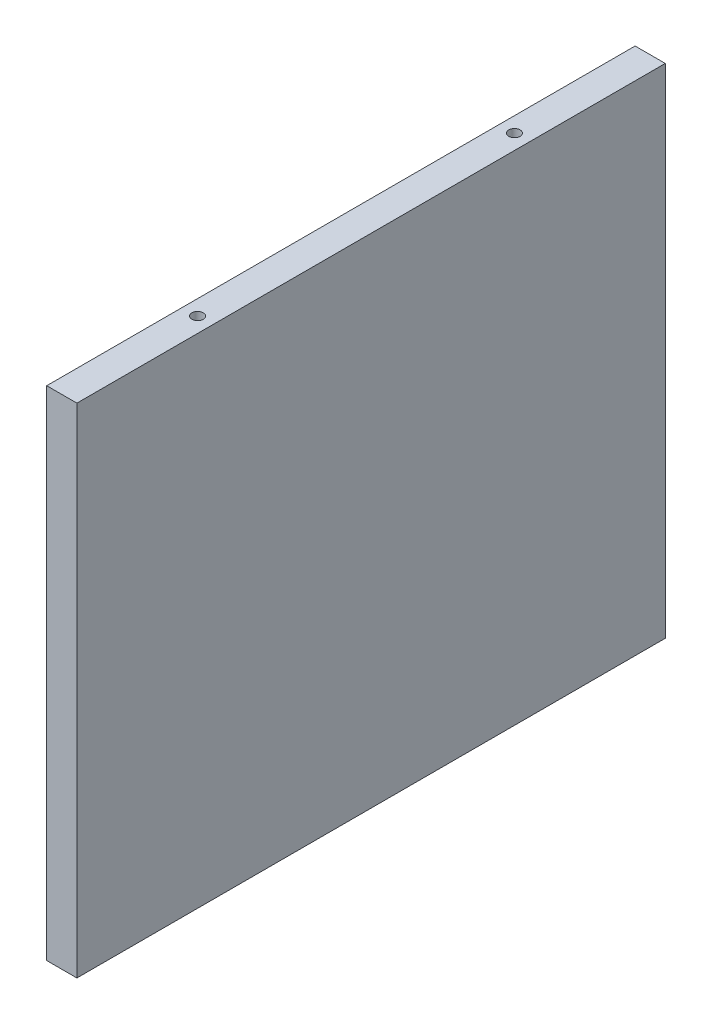
ISO-10303-21;
HEADER;
FILE_DESCRIPTION(('STEP AP214'),'2;1');
FILE_NAME('part.step','',(''),(''),'','','');
FILE_SCHEMA(('AUTOMOTIVE_DESIGN { 1 0 10303 214 1 1 1 1 }'));
ENDSEC;
DATA;
#1=APPLICATION_CONTEXT('core data for automotive mechanical design processes');
#2=APPLICATION_PROTOCOL_DEFINITION('international standard','automotive_design',2000,#1);
#3=PRODUCT_CONTEXT('',#1,'mechanical');
#4=PRODUCT('Part','Part','',(#3));
#5=PRODUCT_RELATED_PRODUCT_CATEGORY('part','',(#4));
#6=PRODUCT_DEFINITION_FORMATION('','',#4);
#7=PRODUCT_DEFINITION_CONTEXT('part definition',#1,'design');
#8=PRODUCT_DEFINITION('design','',#6,#7);
#9=PRODUCT_DEFINITION_SHAPE('','',#8);
#10=(LENGTH_UNIT() NAMED_UNIT(*) SI_UNIT(.MILLI.,.METRE.));
#11=(NAMED_UNIT(*) PLANE_ANGLE_UNIT() SI_UNIT($,.RADIAN.));
#12=(NAMED_UNIT(*) SI_UNIT($,.STERADIAN.) SOLID_ANGLE_UNIT());
#13=UNCERTAINTY_MEASURE_WITH_UNIT(LENGTH_MEASURE(1.E-05),#10,'distance_accuracy_value','');
#14=(GEOMETRIC_REPRESENTATION_CONTEXT(3) GLOBAL_UNCERTAINTY_ASSIGNED_CONTEXT((#13)) GLOBAL_UNIT_ASSIGNED_CONTEXT((#10,
#11,#12)) REPRESENTATION_CONTEXT('',''));
#15=CARTESIAN_POINT('',(0.,0.,0.));
#16=DIRECTION('',(0.,0.,1.));
#17=DIRECTION('',(1.,0.,0.));
#18=AXIS2_PLACEMENT_3D('',#15,#16,#17);
#19=CARTESIAN_POINT('',(10.,330.,195.));
#20=DIRECTION('',(-1.,0.,0.));
#21=DIRECTION('',(0.,0.,1.));
#22=AXIS2_PLACEMENT_3D('',#19,#20,#21);
#23=PLANE('',#22);
#24=DIRECTION('',(0.,0.,-1.));
#25=VECTOR('',#24,1.);
#26=CARTESIAN_POINT('',(10.,0.,195.));
#27=LINE('',#26,#25);
#28=CARTESIAN_POINT('',(10.,0.,195.));
#29=VERTEX_POINT('',#28);
#30=CARTESIAN_POINT('',(10.,0.,-195.));
#31=VERTEX_POINT('',#30);
#32=EDGE_CURVE('E105',#29,#31,#27,.T.);
#33=ORIENTED_EDGE('',*,*,#32,.T.);
#34=DIRECTION('',(0.,-1.,0.));
#35=VECTOR('',#34,1.);
#36=CARTESIAN_POINT('',(10.,330.,-195.));
#37=LINE('',#36,#35);
#38=CARTESIAN_POINT('',(10.,330.,-195.));
#39=VERTEX_POINT('',#38);
#40=EDGE_CURVE('E11',#39,#31,#37,.T.);
#41=ORIENTED_EDGE('',*,*,#40,.F.);
#42=DIRECTION('',(0.,0.,-1.));
#43=VECTOR('',#42,1.);
#44=CARTESIAN_POINT('',(10.,330.,195.));
#45=LINE('',#44,#43);
#46=CARTESIAN_POINT('',(10.,330.,195.));
#47=VERTEX_POINT('',#46);
#48=EDGE_CURVE('E89',#47,#39,#45,.T.);
#49=ORIENTED_EDGE('',*,*,#48,.F.);
#50=DIRECTION('',(0.,-1.,0.));
#51=VECTOR('',#50,1.);
#52=CARTESIAN_POINT('',(10.,330.,195.));
#53=LINE('',#52,#51);
#54=EDGE_CURVE('E98',#47,#29,#53,.T.);
#55=ORIENTED_EDGE('',*,*,#54,.T.);
#56=EDGE_LOOP('',(#33,#41,#49,#55));
#57=FACE_BOUND('',#56,.T.);
#58=ADVANCED_FACE('F39',(#57),#23,.F.);
#59=CARTESIAN_POINT('',(-10.,330.,-195.));
#60=DIRECTION('',(0.,0.,1.));
#61=DIRECTION('',(1.,0.,0.));
#62=AXIS2_PLACEMENT_3D('',#59,#60,#61);
#63=PLANE('',#62);
#64=DIRECTION('',(-1.,0.,0.));
#65=VECTOR('',#64,1.);
#66=CARTESIAN_POINT('',(-10.,0.,-195.));
#67=LINE('',#66,#65);
#68=CARTESIAN_POINT('',(-10.,0.,-195.));
#69=VERTEX_POINT('',#68);
#70=EDGE_CURVE('E94',#31,#69,#67,.T.);
#71=ORIENTED_EDGE('',*,*,#70,.T.);
#72=DIRECTION('',(0.,-1.,0.));
#73=VECTOR('',#72,1.);
#74=CARTESIAN_POINT('',(-10.,330.,-195.));
#75=LINE('',#74,#73);
#76=CARTESIAN_POINT('',(-10.,330.,-195.));
#77=VERTEX_POINT('',#76);
#78=EDGE_CURVE('E50',#77,#69,#75,.T.);
#79=ORIENTED_EDGE('',*,*,#78,.F.);
#80=DIRECTION('',(-1.,0.,0.));
#81=VECTOR('',#80,1.);
#82=CARTESIAN_POINT('',(-10.,330.,-195.));
#83=LINE('',#82,#81);
#84=EDGE_CURVE('E84',#39,#77,#83,.T.);
#85=ORIENTED_EDGE('',*,*,#84,.F.);
#86=ORIENTED_EDGE('',*,*,#40,.T.);
#87=EDGE_LOOP('',(#71,#79,#85,#86));
#88=FACE_BOUND('',#87,.T.);
#89=ADVANCED_FACE('F91',(#88),#63,.F.);
#90=CARTESIAN_POINT('',(-10.,330.,195.));
#91=DIRECTION('',(1.,0.,0.));
#92=DIRECTION('',(0.,0.,-1.));
#93=AXIS2_PLACEMENT_3D('',#90,#91,#92);
#94=PLANE('',#93);
#95=DIRECTION('',(0.,0.,1.));
#96=VECTOR('',#95,1.);
#97=CARTESIAN_POINT('',(-10.,0.,195.));
#98=LINE('',#97,#96);
#99=CARTESIAN_POINT('',(-10.,0.,195.));
#100=VERTEX_POINT('',#99);
#101=EDGE_CURVE('E75',#69,#100,#98,.T.);
#102=ORIENTED_EDGE('',*,*,#101,.T.);
#103=DIRECTION('',(0.,-1.,0.));
#104=VECTOR('',#103,1.);
#105=CARTESIAN_POINT('',(-10.,330.,195.));
#106=LINE('',#105,#104);
#107=CARTESIAN_POINT('',(-10.,330.,195.));
#108=VERTEX_POINT('',#107);
#109=EDGE_CURVE('E92',#108,#100,#106,.T.);
#110=ORIENTED_EDGE('',*,*,#109,.F.);
#111=DIRECTION('',(0.,0.,1.));
#112=VECTOR('',#111,1.);
#113=CARTESIAN_POINT('',(-10.,330.,195.));
#114=LINE('',#113,#112);
#115=EDGE_CURVE('E86',#77,#108,#114,.T.);
#116=ORIENTED_EDGE('',*,*,#115,.F.);
#117=ORIENTED_EDGE('',*,*,#78,.T.);
#118=EDGE_LOOP('',(#102,#110,#116,#117));
#119=FACE_BOUND('',#118,.T.);
#120=ADVANCED_FACE('F96',(#119),#94,.F.);
#121=CARTESIAN_POINT('',(-10.,330.,195.));
#122=DIRECTION('',(0.,0.,-1.));
#123=DIRECTION('',(-1.,0.,0.));
#124=AXIS2_PLACEMENT_3D('',#121,#122,#123);
#125=PLANE('',#124);
#126=DIRECTION('',(1.,0.,0.));
#127=VECTOR('',#126,1.);
#128=CARTESIAN_POINT('',(-10.,0.,195.));
#129=LINE('',#128,#127);
#130=EDGE_CURVE('E77',#100,#29,#129,.T.);
#131=ORIENTED_EDGE('',*,*,#130,.T.);
#132=ORIENTED_EDGE('',*,*,#54,.F.);
#133=DIRECTION('',(1.,0.,0.));
#134=VECTOR('',#133,1.);
#135=CARTESIAN_POINT('',(-10.,330.,195.));
#136=LINE('',#135,#134);
#137=EDGE_CURVE('E54',#108,#47,#136,.T.);
#138=ORIENTED_EDGE('',*,*,#137,.F.);
#139=ORIENTED_EDGE('',*,*,#109,.T.);
#140=EDGE_LOOP('',(#131,#132,#138,#139));
#141=FACE_BOUND('',#140,.T.);
#142=ADVANCED_FACE('F109',(#141),#125,.F.);
#143=CARTESIAN_POINT('',(0.,330.,0.));
#144=DIRECTION('',(0.,-1.,0.));
#145=DIRECTION('',(0.,0.,-1.));
#146=AXIS2_PLACEMENT_3D('',#143,#144,#145);
#147=PLANE('',#146);
#148=CARTESIAN_POINT('',(0.,330.,-105.));
#149=DIRECTION('',(0.,1.,0.));
#150=DIRECTION('',(0.,0.,1.));
#151=AXIS2_PLACEMENT_3D('',#148,#149,#150);
#152=CIRCLE('',#151,3.75);
#153=CARTESIAN_POINT('',(0.,330.,-101.25));
#154=VERTEX_POINT('',#153);
#155=EDGE_CURVE('E122',#154,#154,#152,.T.);
#156=ORIENTED_EDGE('',*,*,#155,.F.);
#157=EDGE_LOOP('',(#156));
#158=FACE_BOUND('',#157,.T.);
#159=CARTESIAN_POINT('',(0.,330.,105.));
#160=DIRECTION('',(0.,1.,0.));
#161=DIRECTION('',(0.,0.,1.));
#162=AXIS2_PLACEMENT_3D('',#159,#160,#161);
#163=CIRCLE('',#162,3.75);
#164=CARTESIAN_POINT('',(0.,330.,108.75));
#165=VERTEX_POINT('',#164);
#166=EDGE_CURVE('E120',#165,#165,#163,.T.);
#167=ORIENTED_EDGE('',*,*,#166,.F.);
#168=EDGE_LOOP('',(#167));
#169=FACE_BOUND('',#168,.T.);
#170=ORIENTED_EDGE('',*,*,#48,.T.);
#171=ORIENTED_EDGE('',*,*,#84,.T.);
#172=ORIENTED_EDGE('',*,*,#115,.T.);
#173=ORIENTED_EDGE('',*,*,#137,.T.);
#174=EDGE_LOOP('',(#170,#171,#172,#173));
#175=FACE_BOUND('',#174,.T.);
#176=ADVANCED_FACE('F88',(#158,#169,#175),#147,.F.);
#177=CARTESIAN_POINT('',(0.,0.,0.));
#178=DIRECTION('',(0.,-1.,0.));
#179=DIRECTION('',(0.,0.,-1.));
#180=AXIS2_PLACEMENT_3D('',#177,#178,#179);
#181=PLANE('',#180);
#182=CARTESIAN_POINT('',(0.,0.,-105.));
#183=DIRECTION('',(0.,-1.,0.));
#184=DIRECTION('',(0.,0.,-1.));
#185=AXIS2_PLACEMENT_3D('',#182,#183,#184);
#186=CIRCLE('',#185,3.75);
#187=CARTESIAN_POINT('',(0.,0.,-108.75));
#188=VERTEX_POINT('',#187);
#189=EDGE_CURVE('E135',#188,#188,#186,.T.);
#190=ORIENTED_EDGE('',*,*,#189,.F.);
#191=EDGE_LOOP('',(#190));
#192=FACE_BOUND('',#191,.T.);
#193=CARTESIAN_POINT('',(0.,0.,105.));
#194=DIRECTION('',(0.,-1.,0.));
#195=DIRECTION('',(0.,0.,-1.));
#196=AXIS2_PLACEMENT_3D('',#193,#194,#195);
#197=CIRCLE('',#196,3.75);
#198=CARTESIAN_POINT('',(0.,0.,101.25));
#199=VERTEX_POINT('',#198);
#200=EDGE_CURVE('E133',#199,#199,#197,.T.);
#201=ORIENTED_EDGE('',*,*,#200,.F.);
#202=EDGE_LOOP('',(#201));
#203=FACE_BOUND('',#202,.T.);
#204=ORIENTED_EDGE('',*,*,#32,.F.);
#205=ORIENTED_EDGE('',*,*,#130,.F.);
#206=ORIENTED_EDGE('',*,*,#101,.F.);
#207=ORIENTED_EDGE('',*,*,#70,.F.);
#208=EDGE_LOOP('',(#204,#205,#206,#207));
#209=FACE_BOUND('',#208,.T.);
#210=ADVANCED_FACE('F114',(#192,#203,#209),#181,.T.);
#211=CARTESIAN_POINT('',(0.,320.,105.));
#212=DIRECTION('',(0.,1.,0.));
#213=DIRECTION('',(0.,0.,1.));
#214=AXIS2_PLACEMENT_3D('',#211,#212,#213);
#215=CYLINDRICAL_SURFACE('',#214,3.75);
#216=CARTESIAN_POINT('',(0.,320.,105.));
#217=DIRECTION('',(0.,1.,0.));
#218=DIRECTION('',(0.,0.,1.));
#219=AXIS2_PLACEMENT_3D('',#216,#217,#218);
#220=CIRCLE('',#219,3.75);
#221=CARTESIAN_POINT('',(0.,320.,108.75));
#222=VERTEX_POINT('',#221);
#223=EDGE_CURVE('E118',#222,#222,#220,.T.);
#224=ORIENTED_EDGE('',*,*,#223,.F.);
#225=EDGE_LOOP('',(#224));
#226=FACE_BOUND('',#225,.T.);
#227=ORIENTED_EDGE('',*,*,#166,.T.);
#228=EDGE_LOOP('',(#227));
#229=FACE_BOUND('',#228,.T.);
#230=ADVANCED_FACE('F151',(#226,#229),#215,.F.);
#231=CARTESIAN_POINT('',(0.,320.,105.));
#232=DIRECTION('',(0.,1.,0.));
#233=DIRECTION('',(0.,0.,1.));
#234=AXIS2_PLACEMENT_3D('',#231,#232,#233);
#235=PLANE('',#234);
#236=ORIENTED_EDGE('',*,*,#223,.T.);
#237=EDGE_LOOP('',(#236));
#238=FACE_BOUND('',#237,.T.);
#239=ADVANCED_FACE('F184',(#238),#235,.T.);
#240=CARTESIAN_POINT('',(0.,320.,-105.));
#241=DIRECTION('',(0.,1.,0.));
#242=DIRECTION('',(0.,0.,1.));
#243=AXIS2_PLACEMENT_3D('',#240,#241,#242);
#244=CYLINDRICAL_SURFACE('',#243,3.75);
#245=CARTESIAN_POINT('',(0.,320.,-105.));
#246=DIRECTION('',(0.,1.,0.));
#247=DIRECTION('',(0.,0.,1.));
#248=AXIS2_PLACEMENT_3D('',#245,#246,#247);
#249=CIRCLE('',#248,3.75);
#250=CARTESIAN_POINT('',(0.,320.,-101.25));
#251=VERTEX_POINT('',#250);
#252=EDGE_CURVE('E104',#251,#251,#249,.T.);
#253=ORIENTED_EDGE('',*,*,#252,.F.);
#254=EDGE_LOOP('',(#253));
#255=FACE_BOUND('',#254,.T.);
#256=ORIENTED_EDGE('',*,*,#155,.T.);
#257=EDGE_LOOP('',(#256));
#258=FACE_BOUND('',#257,.T.);
#259=ADVANCED_FACE('F167',(#255,#258),#244,.F.);
#260=CARTESIAN_POINT('',(0.,320.,-105.));
#261=DIRECTION('',(0.,1.,0.));
#262=DIRECTION('',(0.,0.,1.));
#263=AXIS2_PLACEMENT_3D('',#260,#261,#262);
#264=PLANE('',#263);
#265=ORIENTED_EDGE('',*,*,#252,.T.);
#266=EDGE_LOOP('',(#265));
#267=FACE_BOUND('',#266,.T.);
#268=ADVANCED_FACE('F160',(#267),#264,.T.);
#269=CARTESIAN_POINT('',(0.,10.,105.));
#270=DIRECTION('',(0.,-1.,0.));
#271=DIRECTION('',(0.,0.,-1.));
#272=AXIS2_PLACEMENT_3D('',#269,#270,#271);
#273=CYLINDRICAL_SURFACE('',#272,3.75);
#274=CARTESIAN_POINT('',(0.,10.,105.));
#275=DIRECTION('',(0.,-1.,0.));
#276=DIRECTION('',(0.,0.,-1.));
#277=AXIS2_PLACEMENT_3D('',#274,#275,#276);
#278=CIRCLE('',#277,3.75);
#279=CARTESIAN_POINT('',(0.,10.,101.25));
#280=VERTEX_POINT('',#279);
#281=EDGE_CURVE('E126',#280,#280,#278,.T.);
#282=ORIENTED_EDGE('',*,*,#281,.F.);
#283=EDGE_LOOP('',(#282));
#284=FACE_BOUND('',#283,.T.);
#285=ORIENTED_EDGE('',*,*,#200,.T.);
#286=EDGE_LOOP('',(#285));
#287=FACE_BOUND('',#286,.T.);
#288=ADVANCED_FACE('F154',(#284,#287),#273,.F.);
#289=CARTESIAN_POINT('',(0.,10.,105.));
#290=DIRECTION('',(0.,-1.,0.));
#291=DIRECTION('',(0.,0.,-1.));
#292=AXIS2_PLACEMENT_3D('',#289,#290,#291);
#293=PLANE('',#292);
#294=ORIENTED_EDGE('',*,*,#281,.T.);
#295=EDGE_LOOP('',(#294));
#296=FACE_BOUND('',#295,.T.);
#297=ADVANCED_FACE('F144',(#296),#293,.T.);
#298=CARTESIAN_POINT('',(0.,10.,-105.));
#299=DIRECTION('',(0.,-1.,0.));
#300=DIRECTION('',(0.,0.,-1.));
#301=AXIS2_PLACEMENT_3D('',#298,#299,#300);
#302=CYLINDRICAL_SURFACE('',#301,3.75);
#303=CARTESIAN_POINT('',(0.,10.,-105.));
#304=DIRECTION('',(0.,-1.,0.));
#305=DIRECTION('',(0.,0.,-1.));
#306=AXIS2_PLACEMENT_3D('',#303,#304,#305);
#307=CIRCLE('',#306,3.75);
#308=CARTESIAN_POINT('',(0.,10.,-108.75));
#309=VERTEX_POINT('',#308);
#310=EDGE_CURVE('E116',#309,#309,#307,.T.);
#311=ORIENTED_EDGE('',*,*,#310,.F.);
#312=EDGE_LOOP('',(#311));
#313=FACE_BOUND('',#312,.T.);
#314=ORIENTED_EDGE('',*,*,#189,.T.);
#315=EDGE_LOOP('',(#314));
#316=FACE_BOUND('',#315,.T.);
#317=ADVANCED_FACE('F142',(#313,#316),#302,.F.);
#318=CARTESIAN_POINT('',(0.,10.,-105.));
#319=DIRECTION('',(0.,-1.,0.));
#320=DIRECTION('',(0.,0.,-1.));
#321=AXIS2_PLACEMENT_3D('',#318,#319,#320);
#322=PLANE('',#321);
#323=ORIENTED_EDGE('',*,*,#310,.T.);
#324=EDGE_LOOP('',(#323));
#325=FACE_BOUND('',#324,.T.);
#326=ADVANCED_FACE('F139',(#325),#322,.T.);
#327=CLOSED_SHELL('',(#58,#89,#120,#142,#176,#210,#230,#239,#259,#268,#288,#297,#317,#326));
#328=MANIFOLD_SOLID_BREP('B2',#327);
#329=ADVANCED_BREP_SHAPE_REPRESENTATION('',(#18,#328),#14);
#330=SHAPE_DEFINITION_REPRESENTATION(#9,#329);
ENDSEC;
END-ISO-10303-21;
